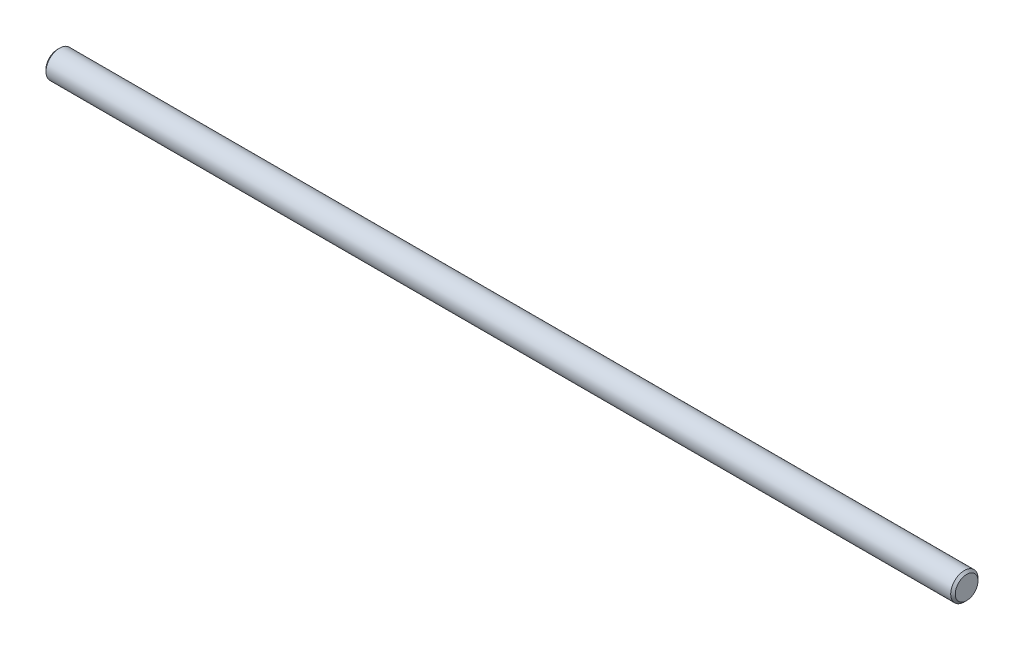
ISO-10303-21;
HEADER;
FILE_DESCRIPTION(('STEP AP214'),'2;1');
FILE_NAME('part.step','',(''),(''),'','','');
FILE_SCHEMA(('AUTOMOTIVE_DESIGN { 1 0 10303 214 1 1 1 1 }'));
ENDSEC;
DATA;
#1=APPLICATION_CONTEXT('core data for automotive mechanical design processes');
#2=APPLICATION_PROTOCOL_DEFINITION('international standard','automotive_design',2000,#1);
#3=PRODUCT_CONTEXT('',#1,'mechanical');
#4=PRODUCT('Part','Part','',(#3));
#5=PRODUCT_RELATED_PRODUCT_CATEGORY('part','',(#4));
#6=PRODUCT_DEFINITION_FORMATION('','',#4);
#7=PRODUCT_DEFINITION_CONTEXT('part definition',#1,'design');
#8=PRODUCT_DEFINITION('design','',#6,#7);
#9=PRODUCT_DEFINITION_SHAPE('','',#8);
#10=(LENGTH_UNIT() NAMED_UNIT(*) SI_UNIT(.MILLI.,.METRE.));
#11=(NAMED_UNIT(*) PLANE_ANGLE_UNIT() SI_UNIT($,.RADIAN.));
#12=(NAMED_UNIT(*) SI_UNIT($,.STERADIAN.) SOLID_ANGLE_UNIT());
#13=UNCERTAINTY_MEASURE_WITH_UNIT(LENGTH_MEASURE(1.E-05),#10,'distance_accuracy_value','');
#14=(GEOMETRIC_REPRESENTATION_CONTEXT(3) GLOBAL_UNCERTAINTY_ASSIGNED_CONTEXT((#13)) GLOBAL_UNIT_ASSIGNED_CONTEXT((#10,
#11,#12)) REPRESENTATION_CONTEXT('',''));
#15=CARTESIAN_POINT('',(0.,0.,0.));
#16=DIRECTION('',(0.,0.,1.));
#17=DIRECTION('',(1.,0.,0.));
#18=AXIS2_PLACEMENT_3D('',#15,#16,#17);
#19=CARTESIAN_POINT('',(400.,0.,0.));
#20=DIRECTION('',(-1.,0.,0.));
#21=DIRECTION('',(0.,0.,1.));
#22=AXIS2_PLACEMENT_3D('',#19,#20,#21);
#23=CYLINDRICAL_SURFACE('',#22,6.);
#24=CARTESIAN_POINT('',(399.,0.,0.));
#25=DIRECTION('',(1.,0.,0.));
#26=DIRECTION('',(0.,0.,-1.));
#27=AXIS2_PLACEMENT_3D('',#24,#25,#26);
#28=CIRCLE('',#27,6.);
#29=CARTESIAN_POINT('',(399.,0.,-6.));
#30=VERTEX_POINT('',#29);
#31=EDGE_CURVE('E37',#30,#30,#28,.F.);
#32=ORIENTED_EDGE('',*,*,#31,.T.);
#33=EDGE_LOOP('',(#32));
#34=FACE_BOUND('',#33,.T.);
#35=CARTESIAN_POINT('',(0.999999999999945,0.,0.));
#36=DIRECTION('',(1.,0.,0.));
#37=DIRECTION('',(0.,0.,-1.));
#38=AXIS2_PLACEMENT_3D('',#35,#36,#37);
#39=CIRCLE('',#38,6.);
#40=CARTESIAN_POINT('',(0.999999999999945,0.,-6.));
#41=VERTEX_POINT('',#40);
#42=EDGE_CURVE('E41',#41,#41,#39,.T.);
#43=ORIENTED_EDGE('',*,*,#42,.T.);
#44=EDGE_LOOP('',(#43));
#45=FACE_BOUND('',#44,.T.);
#46=ADVANCED_FACE('F30',(#34,#45),#23,.T.);
#47=CARTESIAN_POINT('',(400.,0.,0.));
#48=DIRECTION('',(1.,0.,0.));
#49=DIRECTION('',(0.,0.,-1.));
#50=AXIS2_PLACEMENT_3D('',#47,#48,#49);
#51=PLANE('',#50);
#52=CARTESIAN_POINT('',(400.,0.,0.));
#53=DIRECTION('',(1.,0.,0.));
#54=DIRECTION('',(0.,0.,-1.));
#55=AXIS2_PLACEMENT_3D('',#52,#53,#54);
#56=CIRCLE('',#55,5.00000000000012);
#57=CARTESIAN_POINT('',(400.,0.,-5.00000000000012));
#58=VERTEX_POINT('',#57);
#59=EDGE_CURVE('E45',#58,#58,#56,.T.);
#60=ORIENTED_EDGE('',*,*,#59,.T.);
#61=EDGE_LOOP('',(#60));
#62=FACE_BOUND('',#61,.T.);
#63=ADVANCED_FACE('F51',(#62),#51,.T.);
#64=CARTESIAN_POINT('',(0.,0.,0.));
#65=DIRECTION('',(1.,0.,0.));
#66=DIRECTION('',(0.,0.,-1.));
#67=AXIS2_PLACEMENT_3D('',#64,#65,#66);
#68=PLANE('',#67);
#69=CARTESIAN_POINT('',(0.,0.,0.));
#70=DIRECTION('',(1.,0.,0.));
#71=DIRECTION('',(0.,0.,-1.));
#72=AXIS2_PLACEMENT_3D('',#69,#70,#71);
#73=CIRCLE('',#72,5.00000000000006);
#74=CARTESIAN_POINT('',(0.,0.,-5.00000000000006));
#75=VERTEX_POINT('',#74);
#76=EDGE_CURVE('E10',#75,#75,#73,.F.);
#77=ORIENTED_EDGE('',*,*,#76,.T.);
#78=EDGE_LOOP('',(#77));
#79=FACE_BOUND('',#78,.T.);
#80=ADVANCED_FACE('F55',(#79),#68,.F.);
#81=CARTESIAN_POINT('',(400.,0.,0.));
#82=DIRECTION('',(-1.,0.,0.));
#83=DIRECTION('',(0.,0.,1.));
#84=AXIS2_PLACEMENT_3D('',#81,#82,#83);
#85=CONICAL_SURFACE('',#84,5.00000000000012,0.785398163397446);
#86=ORIENTED_EDGE('',*,*,#31,.F.);
#87=EDGE_LOOP('',(#86));
#88=FACE_BOUND('',#87,.T.);
#89=ORIENTED_EDGE('',*,*,#59,.F.);
#90=EDGE_LOOP('',(#89));
#91=FACE_BOUND('',#90,.T.);
#92=ADVANCED_FACE('F53',(#88,#91),#85,.T.);
#93=CARTESIAN_POINT('',(0.999999999999945,0.,0.));
#94=DIRECTION('',(1.,0.,0.));
#95=DIRECTION('',(0.,0.,-1.));
#96=AXIS2_PLACEMENT_3D('',#93,#94,#95);
#97=CONICAL_SURFACE('',#96,6.,0.785398163397446);
#98=ORIENTED_EDGE('',*,*,#76,.F.);
#99=EDGE_LOOP('',(#98));
#100=FACE_BOUND('',#99,.T.);
#101=ORIENTED_EDGE('',*,*,#42,.F.);
#102=EDGE_LOOP('',(#101));
#103=FACE_BOUND('',#102,.T.);
#104=ADVANCED_FACE('F32',(#100,#103),#97,.T.);
#105=CLOSED_SHELL('',(#46,#63,#80,#92,#104));
#106=MANIFOLD_SOLID_BREP('B2',#105);
#107=ADVANCED_BREP_SHAPE_REPRESENTATION('',(#18,#106),#14);
#108=SHAPE_DEFINITION_REPRESENTATION(#9,#107);
ENDSEC;
END-ISO-10303-21;
